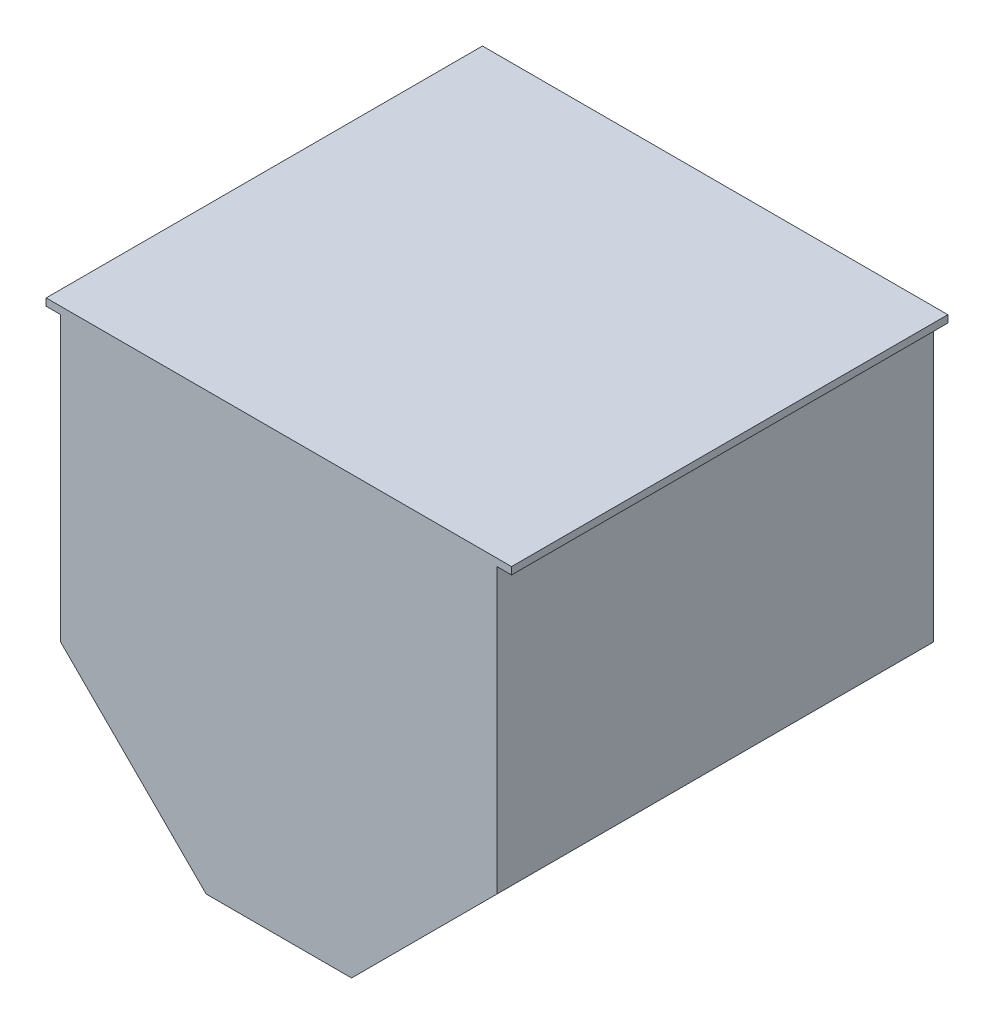
ISO-10303-21;
HEADER;
FILE_DESCRIPTION(('STEP AP214'),'2;1');
FILE_NAME('part.step','',(''),(''),'','','');
FILE_SCHEMA(('AUTOMOTIVE_DESIGN { 1 0 10303 214 1 1 1 1 }'));
ENDSEC;
DATA;
#1=APPLICATION_CONTEXT('core data for automotive mechanical design processes');
#2=APPLICATION_PROTOCOL_DEFINITION('international standard','automotive_design',2000,#1);
#3=PRODUCT_CONTEXT('',#1,'mechanical');
#4=PRODUCT('Part','Part','',(#3));
#5=PRODUCT_RELATED_PRODUCT_CATEGORY('part','',(#4));
#6=PRODUCT_DEFINITION_FORMATION('','',#4);
#7=PRODUCT_DEFINITION_CONTEXT('part definition',#1,'design');
#8=PRODUCT_DEFINITION('design','',#6,#7);
#9=PRODUCT_DEFINITION_SHAPE('','',#8);
#10=(LENGTH_UNIT() NAMED_UNIT(*) SI_UNIT(.MILLI.,.METRE.));
#11=(NAMED_UNIT(*) PLANE_ANGLE_UNIT() SI_UNIT($,.RADIAN.));
#12=(NAMED_UNIT(*) SI_UNIT($,.STERADIAN.) SOLID_ANGLE_UNIT());
#13=UNCERTAINTY_MEASURE_WITH_UNIT(LENGTH_MEASURE(1.E-05),#10,'distance_accuracy_value','');
#14=(GEOMETRIC_REPRESENTATION_CONTEXT(3) GLOBAL_UNCERTAINTY_ASSIGNED_CONTEXT((#13)) GLOBAL_UNIT_ASSIGNED_CONTEXT((#10,
#11,#12)) REPRESENTATION_CONTEXT('',''));
#15=CARTESIAN_POINT('',(0.,0.,0.));
#16=DIRECTION('',(0.,0.,1.));
#17=DIRECTION('',(1.,0.,0.));
#18=AXIS2_PLACEMENT_3D('',#15,#16,#17);
#19=CARTESIAN_POINT('',(0.,126.859504132231,300.));
#20=DIRECTION('',(0.,-1.,0.));
#21=DIRECTION('',(1.,0.,0.));
#22=AXIS2_PLACEMENT_3D('',#19,#20,#21);
#23=PLANE('',#22);
#24=DIRECTION('',(-1.,0.,0.));
#25=VECTOR('',#24,1.);
#26=CARTESIAN_POINT('',(0.,126.859504132231,0.));
#27=LINE('',#26,#25);
#28=CARTESIAN_POINT('',(164.545454545455,126.859504132231,0.));
#29=VERTEX_POINT('',#28);
#30=CARTESIAN_POINT('',(-155.454545454546,126.859504132231,0.));
#31=VERTEX_POINT('',#30);
#32=EDGE_CURVE('E141',#29,#31,#27,.T.);
#33=ORIENTED_EDGE('',*,*,#32,.T.);
#34=DIRECTION('',(0.,0.,-1.));
#35=VECTOR('',#34,1.);
#36=CARTESIAN_POINT('',(-155.454545454546,126.859504132231,300.));
#37=LINE('',#36,#35);
#38=CARTESIAN_POINT('',(-155.454545454546,126.859504132231,300.));
#39=VERTEX_POINT('',#38);
#40=EDGE_CURVE('E11',#39,#31,#37,.T.);
#41=ORIENTED_EDGE('',*,*,#40,.F.);
#42=DIRECTION('',(-1.,0.,0.));
#43=VECTOR('',#42,1.);
#44=CARTESIAN_POINT('',(0.,126.859504132231,300.));
#45=LINE('',#44,#43);
#46=CARTESIAN_POINT('',(164.545454545455,126.859504132231,300.));
#47=VERTEX_POINT('',#46);
#48=EDGE_CURVE('E165',#47,#39,#45,.T.);
#49=ORIENTED_EDGE('',*,*,#48,.F.);
#50=DIRECTION('',(0.,0.,-1.));
#51=VECTOR('',#50,1.);
#52=CARTESIAN_POINT('',(164.545454545455,126.859504132231,300.));
#53=LINE('',#52,#51);
#54=EDGE_CURVE('E49',#47,#29,#53,.T.);
#55=ORIENTED_EDGE('',*,*,#54,.T.);
#56=EDGE_LOOP('',(#33,#41,#49,#55));
#57=FACE_BOUND('',#56,.T.);
#58=ADVANCED_FACE('F33',(#57),#23,.F.);
#59=CARTESIAN_POINT('',(-155.454545454546,0.,300.));
#60=DIRECTION('',(1.,0.,0.));
#61=DIRECTION('',(0.,0.,-1.));
#62=AXIS2_PLACEMENT_3D('',#59,#60,#61);
#63=PLANE('',#62);
#64=DIRECTION('',(0.,-1.,0.));
#65=VECTOR('',#64,1.);
#66=CARTESIAN_POINT('',(-155.454545454546,0.,0.));
#67=LINE('',#66,#65);
#68=CARTESIAN_POINT('',(-155.454545454546,121.859504132231,0.));
#69=VERTEX_POINT('',#68);
#70=EDGE_CURVE('E143',#31,#69,#67,.T.);
#71=ORIENTED_EDGE('',*,*,#70,.T.);
#72=DIRECTION('',(0.,0.,-1.));
#73=VECTOR('',#72,1.);
#74=CARTESIAN_POINT('',(-155.454545454546,121.859504132231,300.));
#75=LINE('',#74,#73);
#76=CARTESIAN_POINT('',(-155.454545454546,121.859504132231,300.));
#77=VERTEX_POINT('',#76);
#78=EDGE_CURVE('E41',#77,#69,#75,.T.);
#79=ORIENTED_EDGE('',*,*,#78,.F.);
#80=DIRECTION('',(0.,-1.,0.));
#81=VECTOR('',#80,1.);
#82=CARTESIAN_POINT('',(-155.454545454546,0.,300.));
#83=LINE('',#82,#81);
#84=EDGE_CURVE('E93',#39,#77,#83,.T.);
#85=ORIENTED_EDGE('',*,*,#84,.F.);
#86=ORIENTED_EDGE('',*,*,#40,.T.);
#87=EDGE_LOOP('',(#71,#79,#85,#86));
#88=FACE_BOUND('',#87,.T.);
#89=ADVANCED_FACE('F184',(#88),#63,.F.);
#90=CARTESIAN_POINT('',(0.,121.859504132231,300.));
#91=DIRECTION('',(0.,-1.,0.));
#92=DIRECTION('',(0.,0.,-1.));
#93=AXIS2_PLACEMENT_3D('',#90,#91,#92);
#94=PLANE('',#93);
#95=DIRECTION('',(-1.,0.,0.));
#96=VECTOR('',#95,1.);
#97=CARTESIAN_POINT('',(0.,121.859504132231,0.));
#98=LINE('',#97,#96);
#99=CARTESIAN_POINT('',(-145.454545454545,121.859504132231,0.));
#100=VERTEX_POINT('',#99);
#101=EDGE_CURVE('E146',#100,#69,#98,.T.);
#102=ORIENTED_EDGE('',*,*,#101,.F.);
#103=DIRECTION('',(0.,0.,-1.));
#104=VECTOR('',#103,1.);
#105=CARTESIAN_POINT('',(-145.454545454545,121.859504132231,300.));
#106=LINE('',#105,#104);
#107=CARTESIAN_POINT('',(-145.454545454545,121.859504132231,300.));
#108=VERTEX_POINT('',#107);
#109=EDGE_CURVE('E177',#108,#100,#106,.T.);
#110=ORIENTED_EDGE('',*,*,#109,.F.);
#111=DIRECTION('',(-1.,0.,0.));
#112=VECTOR('',#111,1.);
#113=CARTESIAN_POINT('',(0.,121.859504132231,300.));
#114=LINE('',#113,#112);
#115=EDGE_CURVE('E183',#108,#77,#114,.T.);
#116=ORIENTED_EDGE('',*,*,#115,.T.);
#117=ORIENTED_EDGE('',*,*,#78,.T.);
#118=EDGE_LOOP('',(#102,#110,#116,#117));
#119=FACE_BOUND('',#118,.T.);
#120=ADVANCED_FACE('F181',(#119),#94,.T.);
#121=CARTESIAN_POINT('',(-145.454545454545,0.,300.));
#122=DIRECTION('',(1.,0.,0.));
#123=DIRECTION('',(0.,1.,0.));
#124=AXIS2_PLACEMENT_3D('',#121,#122,#123);
#125=PLANE('',#124);
#126=DIRECTION('',(0.,-1.,0.));
#127=VECTOR('',#126,1.);
#128=CARTESIAN_POINT('',(-145.454545454545,0.,0.));
#129=LINE('',#128,#127);
#130=CARTESIAN_POINT('',(-145.454545454545,-73.1404958677686,0.));
#131=VERTEX_POINT('',#130);
#132=EDGE_CURVE('E149',#100,#131,#129,.T.);
#133=ORIENTED_EDGE('',*,*,#132,.T.);
#134=DIRECTION('',(0.,0.,-1.));
#135=VECTOR('',#134,1.);
#136=CARTESIAN_POINT('',(-145.454545454545,-73.1404958677686,300.));
#137=LINE('',#136,#135);
#138=CARTESIAN_POINT('',(-145.454545454545,-73.1404958677686,300.));
#139=VERTEX_POINT('',#138);
#140=EDGE_CURVE('E174',#139,#131,#137,.T.);
#141=ORIENTED_EDGE('',*,*,#140,.F.);
#142=DIRECTION('',(0.,-1.,0.));
#143=VECTOR('',#142,1.);
#144=CARTESIAN_POINT('',(-145.454545454545,0.,300.));
#145=LINE('',#144,#143);
#146=EDGE_CURVE('E202',#108,#139,#145,.T.);
#147=ORIENTED_EDGE('',*,*,#146,.F.);
#148=ORIENTED_EDGE('',*,*,#109,.T.);
#149=EDGE_LOOP('',(#133,#141,#147,#148));
#150=FACE_BOUND('',#149,.T.);
#151=ADVANCED_FACE('F193',(#150),#125,.F.);
#152=CARTESIAN_POINT('',(-109.297520661157,-109.297520661157,300.));
#153=DIRECTION('',(0.707106781186548,0.707106781186547,0.));
#154=DIRECTION('',(-0.707106781186547,0.707106781186548,0.));
#155=AXIS2_PLACEMENT_3D('',#152,#153,#154);
#156=PLANE('',#155);
#157=DIRECTION('',(0.707106781186547,-0.707106781186548,0.));
#158=VECTOR('',#157,1.);
#159=CARTESIAN_POINT('',(-109.297520661157,-109.297520661157,0.));
#160=LINE('',#159,#158);
#161=CARTESIAN_POINT('',(-45.4545454545454,-173.140495867769,0.));
#162=VERTEX_POINT('',#161);
#163=EDGE_CURVE('E151',#131,#162,#160,.T.);
#164=ORIENTED_EDGE('',*,*,#163,.T.);
#165=DIRECTION('',(0.,0.,-1.));
#166=VECTOR('',#165,1.);
#167=CARTESIAN_POINT('',(-45.4545454545454,-173.140495867769,300.));
#168=LINE('',#167,#166);
#169=CARTESIAN_POINT('',(-45.4545454545454,-173.140495867769,300.));
#170=VERTEX_POINT('',#169);
#171=EDGE_CURVE('E171',#170,#162,#168,.T.);
#172=ORIENTED_EDGE('',*,*,#171,.F.);
#173=DIRECTION('',(0.707106781186547,-0.707106781186548,0.));
#174=VECTOR('',#173,1.);
#175=CARTESIAN_POINT('',(-109.297520661157,-109.297520661157,300.));
#176=LINE('',#175,#174);
#177=EDGE_CURVE('E199',#139,#170,#176,.T.);
#178=ORIENTED_EDGE('',*,*,#177,.F.);
#179=ORIENTED_EDGE('',*,*,#140,.T.);
#180=EDGE_LOOP('',(#164,#172,#178,#179));
#181=FACE_BOUND('',#180,.T.);
#182=ADVANCED_FACE('F197',(#181),#156,.F.);
#183=CARTESIAN_POINT('',(0.,-173.140495867769,300.));
#184=DIRECTION('',(0.,1.,0.));
#185=DIRECTION('',(0.,0.,1.));
#186=AXIS2_PLACEMENT_3D('',#183,#184,#185);
#187=PLANE('',#186);
#188=DIRECTION('',(1.,0.,0.));
#189=VECTOR('',#188,1.);
#190=CARTESIAN_POINT('',(0.,-173.140495867769,0.));
#191=LINE('',#190,#189);
#192=CARTESIAN_POINT('',(54.5454545454546,-173.140495867769,0.));
#193=VERTEX_POINT('',#192);
#194=EDGE_CURVE('E153',#162,#193,#191,.T.);
#195=ORIENTED_EDGE('',*,*,#194,.T.);
#196=DIRECTION('',(0.,0.,-1.));
#197=VECTOR('',#196,1.);
#198=CARTESIAN_POINT('',(54.5454545454546,-173.140495867769,300.));
#199=LINE('',#198,#197);
#200=CARTESIAN_POINT('',(54.5454545454546,-173.140495867769,300.));
#201=VERTEX_POINT('',#200);
#202=EDGE_CURVE('E169',#201,#193,#199,.T.);
#203=ORIENTED_EDGE('',*,*,#202,.F.);
#204=DIRECTION('',(1.,0.,0.));
#205=VECTOR('',#204,1.);
#206=CARTESIAN_POINT('',(0.,-173.140495867769,300.));
#207=LINE('',#206,#205);
#208=EDGE_CURVE('E201',#170,#201,#207,.T.);
#209=ORIENTED_EDGE('',*,*,#208,.F.);
#210=ORIENTED_EDGE('',*,*,#171,.T.);
#211=EDGE_LOOP('',(#195,#203,#209,#210));
#212=FACE_BOUND('',#211,.T.);
#213=ADVANCED_FACE('F236',(#212),#187,.F.);
#214=CARTESIAN_POINT('',(113.842975206612,-113.842975206612,300.));
#215=DIRECTION('',(0.707106781186548,-0.707106781186548,0.));
#216=DIRECTION('',(0.707106781186548,0.707106781186548,0.));
#217=AXIS2_PLACEMENT_3D('',#214,#215,#216);
#218=PLANE('',#217);
#219=DIRECTION('',(-0.707106781186548,-0.707106781186548,0.));
#220=VECTOR('',#219,1.);
#221=CARTESIAN_POINT('',(113.842975206612,-113.842975206612,0.));
#222=LINE('',#221,#220);
#223=CARTESIAN_POINT('',(154.545454545455,-73.1404958677686,0.));
#224=VERTEX_POINT('',#223);
#225=EDGE_CURVE('E156',#224,#193,#222,.T.);
#226=ORIENTED_EDGE('',*,*,#225,.F.);
#227=DIRECTION('',(0.,0.,-1.));
#228=VECTOR('',#227,1.);
#229=CARTESIAN_POINT('',(154.545454545455,-73.1404958677686,300.));
#230=LINE('',#229,#228);
#231=CARTESIAN_POINT('',(154.545454545455,-73.1404958677686,300.));
#232=VERTEX_POINT('',#231);
#233=EDGE_CURVE('E124',#232,#224,#230,.T.);
#234=ORIENTED_EDGE('',*,*,#233,.F.);
#235=DIRECTION('',(-0.707106781186548,-0.707106781186548,0.));
#236=VECTOR('',#235,1.);
#237=CARTESIAN_POINT('',(113.842975206612,-113.842975206612,300.));
#238=LINE('',#237,#236);
#239=EDGE_CURVE('E133',#232,#201,#238,.T.);
#240=ORIENTED_EDGE('',*,*,#239,.T.);
#241=ORIENTED_EDGE('',*,*,#202,.T.);
#242=EDGE_LOOP('',(#226,#234,#240,#241));
#243=FACE_BOUND('',#242,.T.);
#244=ADVANCED_FACE('F209',(#243),#218,.T.);
#245=CARTESIAN_POINT('',(154.545454545455,0.,300.));
#246=DIRECTION('',(1.,0.,0.));
#247=DIRECTION('',(0.,0.,-1.));
#248=AXIS2_PLACEMENT_3D('',#245,#246,#247);
#249=PLANE('',#248);
#250=DIRECTION('',(0.,-1.,0.));
#251=VECTOR('',#250,1.);
#252=CARTESIAN_POINT('',(154.545454545455,0.,0.));
#253=LINE('',#252,#251);
#254=CARTESIAN_POINT('',(154.545454545455,121.859504132231,0.));
#255=VERTEX_POINT('',#254);
#256=EDGE_CURVE('E120',#255,#224,#253,.T.);
#257=ORIENTED_EDGE('',*,*,#256,.F.);
#258=DIRECTION('',(0.,0.,-1.));
#259=VECTOR('',#258,1.);
#260=CARTESIAN_POINT('',(154.545454545455,121.859504132231,300.));
#261=LINE('',#260,#259);
#262=CARTESIAN_POINT('',(154.545454545455,121.859504132231,300.));
#263=VERTEX_POINT('',#262);
#264=EDGE_CURVE('E115',#263,#255,#261,.T.);
#265=ORIENTED_EDGE('',*,*,#264,.F.);
#266=DIRECTION('',(0.,-1.,0.));
#267=VECTOR('',#266,1.);
#268=CARTESIAN_POINT('',(154.545454545455,0.,300.));
#269=LINE('',#268,#267);
#270=EDGE_CURVE('E118',#263,#232,#269,.T.);
#271=ORIENTED_EDGE('',*,*,#270,.T.);
#272=ORIENTED_EDGE('',*,*,#233,.T.);
#273=EDGE_LOOP('',(#257,#265,#271,#272));
#274=FACE_BOUND('',#273,.T.);
#275=ADVANCED_FACE('F117',(#274),#249,.T.);
#276=CARTESIAN_POINT('',(0.,121.859504132231,300.));
#277=DIRECTION('',(0.,-1.,0.));
#278=DIRECTION('',(0.,0.,-1.));
#279=AXIS2_PLACEMENT_3D('',#276,#277,#278);
#280=PLANE('',#279);
#281=DIRECTION('',(-1.,0.,0.));
#282=VECTOR('',#281,1.);
#283=CARTESIAN_POINT('',(0.,121.859504132231,0.));
#284=LINE('',#283,#282);
#285=CARTESIAN_POINT('',(164.545454545455,121.859504132231,0.));
#286=VERTEX_POINT('',#285);
#287=EDGE_CURVE('E160',#286,#255,#284,.T.);
#288=ORIENTED_EDGE('',*,*,#287,.F.);
#289=DIRECTION('',(0.,0.,-1.));
#290=VECTOR('',#289,1.);
#291=CARTESIAN_POINT('',(164.545454545455,121.859504132231,300.));
#292=LINE('',#291,#290);
#293=CARTESIAN_POINT('',(164.545454545455,121.859504132231,300.));
#294=VERTEX_POINT('',#293);
#295=EDGE_CURVE('E81',#294,#286,#292,.T.);
#296=ORIENTED_EDGE('',*,*,#295,.F.);
#297=DIRECTION('',(-1.,0.,0.));
#298=VECTOR('',#297,1.);
#299=CARTESIAN_POINT('',(0.,121.859504132231,300.));
#300=LINE('',#299,#298);
#301=EDGE_CURVE('E131',#294,#263,#300,.T.);
#302=ORIENTED_EDGE('',*,*,#301,.T.);
#303=ORIENTED_EDGE('',*,*,#264,.T.);
#304=EDGE_LOOP('',(#288,#296,#302,#303));
#305=FACE_BOUND('',#304,.T.);
#306=ADVANCED_FACE('F135',(#305),#280,.T.);
#307=CARTESIAN_POINT('',(164.545454545455,0.,300.));
#308=DIRECTION('',(1.,0.,0.));
#309=DIRECTION('',(0.,0.,-1.));
#310=AXIS2_PLACEMENT_3D('',#307,#308,#309);
#311=PLANE('',#310);
#312=DIRECTION('',(0.,-1.,0.));
#313=VECTOR('',#312,1.);
#314=CARTESIAN_POINT('',(164.545454545455,0.,0.));
#315=LINE('',#314,#313);
#316=EDGE_CURVE('E162',#29,#286,#315,.T.);
#317=ORIENTED_EDGE('',*,*,#316,.F.);
#318=ORIENTED_EDGE('',*,*,#54,.F.);
#319=DIRECTION('',(0.,-1.,0.));
#320=VECTOR('',#319,1.);
#321=CARTESIAN_POINT('',(164.545454545455,0.,300.));
#322=LINE('',#321,#320);
#323=EDGE_CURVE('E136',#47,#294,#322,.T.);
#324=ORIENTED_EDGE('',*,*,#323,.T.);
#325=ORIENTED_EDGE('',*,*,#295,.T.);
#326=EDGE_LOOP('',(#317,#318,#324,#325));
#327=FACE_BOUND('',#326,.T.);
#328=ADVANCED_FACE('F211',(#327),#311,.T.);
#329=CARTESIAN_POINT('',(0.,0.,300.));
#330=DIRECTION('',(0.,0.,1.));
#331=DIRECTION('',(1.,0.,0.));
#332=AXIS2_PLACEMENT_3D('',#329,#330,#331);
#333=PLANE('',#332);
#334=ORIENTED_EDGE('',*,*,#48,.T.);
#335=ORIENTED_EDGE('',*,*,#84,.T.);
#336=ORIENTED_EDGE('',*,*,#115,.F.);
#337=ORIENTED_EDGE('',*,*,#146,.T.);
#338=ORIENTED_EDGE('',*,*,#177,.T.);
#339=ORIENTED_EDGE('',*,*,#208,.T.);
#340=ORIENTED_EDGE('',*,*,#239,.F.);
#341=ORIENTED_EDGE('',*,*,#270,.F.);
#342=ORIENTED_EDGE('',*,*,#301,.F.);
#343=ORIENTED_EDGE('',*,*,#323,.F.);
#344=EDGE_LOOP('',(#334,#335,#336,#337,#338,#339,#340,#341,#342,#343));
#345=FACE_BOUND('',#344,.T.);
#346=ADVANCED_FACE('F129',(#345),#333,.T.);
#347=CARTESIAN_POINT('',(0.,0.,0.));
#348=DIRECTION('',(0.,0.,1.));
#349=DIRECTION('',(1.,0.,0.));
#350=AXIS2_PLACEMENT_3D('',#347,#348,#349);
#351=PLANE('',#350);
#352=ORIENTED_EDGE('',*,*,#32,.F.);
#353=ORIENTED_EDGE('',*,*,#316,.T.);
#354=ORIENTED_EDGE('',*,*,#287,.T.);
#355=ORIENTED_EDGE('',*,*,#256,.T.);
#356=ORIENTED_EDGE('',*,*,#225,.T.);
#357=ORIENTED_EDGE('',*,*,#194,.F.);
#358=ORIENTED_EDGE('',*,*,#163,.F.);
#359=ORIENTED_EDGE('',*,*,#132,.F.);
#360=ORIENTED_EDGE('',*,*,#101,.T.);
#361=ORIENTED_EDGE('',*,*,#70,.F.);
#362=EDGE_LOOP('',(#352,#353,#354,#355,#356,#357,#358,#359,#360,#361));
#363=FACE_BOUND('',#362,.T.);
#364=ADVANCED_FACE('F188',(#363),#351,.F.);
#365=CLOSED_SHELL('',(#58,#89,#120,#151,#182,#213,#244,#275,#306,#328,#346,#364));
#366=MANIFOLD_SOLID_BREP('B2',#365);
#367=ADVANCED_BREP_SHAPE_REPRESENTATION('',(#18,#366),#14);
#368=SHAPE_DEFINITION_REPRESENTATION(#9,#367);
ENDSEC;
END-ISO-10303-21;
